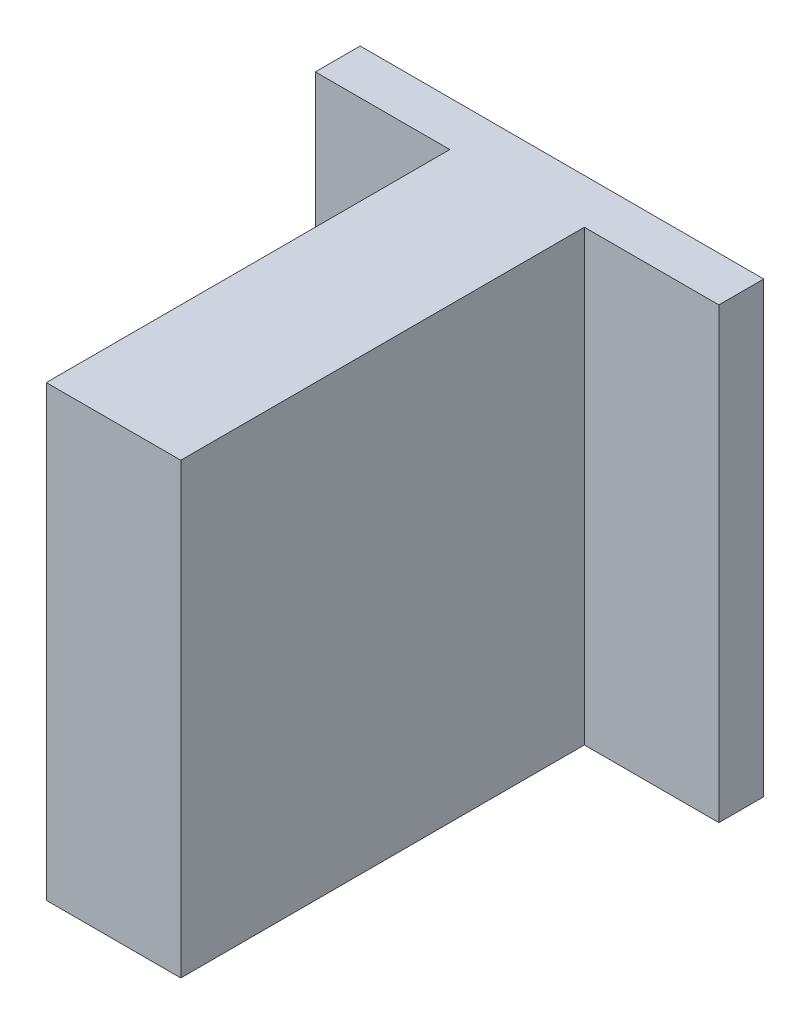
ISO-10303-21;
HEADER;
FILE_DESCRIPTION(('STEP AP214'),'2;1');
FILE_NAME('part.step','',(''),(''),'','','');
FILE_SCHEMA(('AUTOMOTIVE_DESIGN { 1 0 10303 214 1 1 1 1 }'));
ENDSEC;
DATA;
#1=APPLICATION_CONTEXT('core data for automotive mechanical design processes');
#2=APPLICATION_PROTOCOL_DEFINITION('international standard','automotive_design',2000,#1);
#3=PRODUCT_CONTEXT('',#1,'mechanical');
#4=PRODUCT('Part','Part','',(#3));
#5=PRODUCT_RELATED_PRODUCT_CATEGORY('part','',(#4));
#6=PRODUCT_DEFINITION_FORMATION('','',#4);
#7=PRODUCT_DEFINITION_CONTEXT('part definition',#1,'design');
#8=PRODUCT_DEFINITION('design','',#6,#7);
#9=PRODUCT_DEFINITION_SHAPE('','',#8);
#10=(LENGTH_UNIT() NAMED_UNIT(*) SI_UNIT(.MILLI.,.METRE.));
#11=(NAMED_UNIT(*) PLANE_ANGLE_UNIT() SI_UNIT($,.RADIAN.));
#12=(NAMED_UNIT(*) SI_UNIT($,.STERADIAN.) SOLID_ANGLE_UNIT());
#13=UNCERTAINTY_MEASURE_WITH_UNIT(LENGTH_MEASURE(1.E-05),#10,'distance_accuracy_value','');
#14=(GEOMETRIC_REPRESENTATION_CONTEXT(3) GLOBAL_UNCERTAINTY_ASSIGNED_CONTEXT((#13)) GLOBAL_UNIT_ASSIGNED_CONTEXT((#10,
#11,#12)) REPRESENTATION_CONTEXT('',''));
#15=CARTESIAN_POINT('',(0.,0.,0.));
#16=DIRECTION('',(0.,0.,1.));
#17=DIRECTION('',(1.,0.,0.));
#18=AXIS2_PLACEMENT_3D('',#15,#16,#17);
#19=CARTESIAN_POINT('',(0.,0.,0.));
#20=DIRECTION('',(1.,0.,0.));
#21=DIRECTION('',(0.,0.,-1.));
#22=AXIS2_PLACEMENT_3D('',#19,#20,#21);
#23=PLANE('',#22);
#24=DIRECTION('',(0.,1.,0.));
#25=VECTOR('',#24,1.);
#26=CARTESIAN_POINT('',(0.,25.4,2.54));
#27=LINE('',#26,#25);
#28=CARTESIAN_POINT('',(0.,0.,2.54));
#29=VERTEX_POINT('',#28);
#30=CARTESIAN_POINT('',(0.,25.4,2.54));
#31=VERTEX_POINT('',#30);
#32=EDGE_CURVE('E63',#29,#31,#27,.T.);
#33=ORIENTED_EDGE('',*,*,#32,.F.);
#34=DIRECTION('',(0.,0.,-1.));
#35=VECTOR('',#34,1.);
#36=CARTESIAN_POINT('',(0.,0.,0.));
#37=LINE('',#36,#35);
#38=CARTESIAN_POINT('',(0.,0.,25.4));
#39=VERTEX_POINT('',#38);
#40=EDGE_CURVE('E171',#39,#29,#37,.T.);
#41=ORIENTED_EDGE('',*,*,#40,.F.);
#42=DIRECTION('',(0.,-1.,0.));
#43=VECTOR('',#42,1.);
#44=CARTESIAN_POINT('',(0.,0.,25.4));
#45=LINE('',#44,#43);
#46=CARTESIAN_POINT('',(0.,25.4,25.4));
#47=VERTEX_POINT('',#46);
#48=EDGE_CURVE('E168',#47,#39,#45,.T.);
#49=ORIENTED_EDGE('',*,*,#48,.F.);
#50=DIRECTION('',(0.,0.,1.));
#51=VECTOR('',#50,1.);
#52=CARTESIAN_POINT('',(0.,25.4,0.));
#53=LINE('',#52,#51);
#54=EDGE_CURVE('E165',#31,#47,#53,.T.);
#55=ORIENTED_EDGE('',*,*,#54,.F.);
#56=EDGE_LOOP('',(#33,#41,#49,#55));
#57=FACE_BOUND('',#56,.T.);
#58=ADVANCED_FACE('F39',(#57),#23,.F.);
#59=CARTESIAN_POINT('',(3.81,0.,0.));
#60=DIRECTION('',(0.,0.,1.));
#61=DIRECTION('',(1.,0.,0.));
#62=AXIS2_PLACEMENT_3D('',#59,#60,#61);
#63=PLANE('',#62);
#64=DIRECTION('',(-1.,0.,0.));
#65=VECTOR('',#64,1.);
#66=CARTESIAN_POINT('',(3.81,0.,0.));
#67=LINE('',#66,#65);
#68=CARTESIAN_POINT('',(15.24,0.,0.));
#69=VERTEX_POINT('',#68);
#70=CARTESIAN_POINT('',(-7.62,0.,0.));
#71=VERTEX_POINT('',#70);
#72=EDGE_CURVE('E174',#69,#71,#67,.T.);
#73=ORIENTED_EDGE('',*,*,#72,.T.);
#74=DIRECTION('',(0.,-1.,0.));
#75=VECTOR('',#74,1.);
#76=CARTESIAN_POINT('',(-7.62,25.4,0.));
#77=LINE('',#76,#75);
#78=CARTESIAN_POINT('',(-7.62,25.4,0.));
#79=VERTEX_POINT('',#78);
#80=EDGE_CURVE('E141',#79,#71,#77,.T.);
#81=ORIENTED_EDGE('',*,*,#80,.F.);
#82=DIRECTION('',(-1.,0.,0.));
#83=VECTOR('',#82,1.);
#84=CARTESIAN_POINT('',(3.81,25.4,0.));
#85=LINE('',#84,#83);
#86=CARTESIAN_POINT('',(15.24,25.4,0.));
#87=VERTEX_POINT('',#86);
#88=EDGE_CURVE('E11',#87,#79,#85,.T.);
#89=ORIENTED_EDGE('',*,*,#88,.F.);
#90=DIRECTION('',(0.,-1.,0.));
#91=VECTOR('',#90,1.);
#92=CARTESIAN_POINT('',(15.24,25.4,0.));
#93=LINE('',#92,#91);
#94=EDGE_CURVE('E113',#87,#69,#93,.T.);
#95=ORIENTED_EDGE('',*,*,#94,.T.);
#96=EDGE_LOOP('',(#73,#81,#89,#95));
#97=FACE_BOUND('',#96,.T.);
#98=ADVANCED_FACE('F41',(#97),#63,.F.);
#99=CARTESIAN_POINT('',(3.81,25.4,0.));
#100=DIRECTION('',(0.,-1.,0.));
#101=DIRECTION('',(0.,0.,-1.));
#102=AXIS2_PLACEMENT_3D('',#99,#100,#101);
#103=PLANE('',#102);
#104=ORIENTED_EDGE('',*,*,#88,.T.);
#105=DIRECTION('',(0.,0.,-1.));
#106=VECTOR('',#105,1.);
#107=CARTESIAN_POINT('',(-7.62,25.4,2.54));
#108=LINE('',#107,#106);
#109=CARTESIAN_POINT('',(-7.62,25.4,2.54));
#110=VERTEX_POINT('',#109);
#111=EDGE_CURVE('E161',#110,#79,#108,.T.);
#112=ORIENTED_EDGE('',*,*,#111,.F.);
#113=DIRECTION('',(-1.,0.,0.));
#114=VECTOR('',#113,1.);
#115=CARTESIAN_POINT('',(0.,25.4,2.54));
#116=LINE('',#115,#114);
#117=EDGE_CURVE('E144',#31,#110,#116,.T.);
#118=ORIENTED_EDGE('',*,*,#117,.F.);
#119=ORIENTED_EDGE('',*,*,#54,.T.);
#120=DIRECTION('',(-1.,0.,0.));
#121=VECTOR('',#120,1.);
#122=CARTESIAN_POINT('',(3.81,25.4,25.4));
#123=LINE('',#122,#121);
#124=CARTESIAN_POINT('',(7.62,25.4,25.4));
#125=VERTEX_POINT('',#124);
#126=EDGE_CURVE('E48',#125,#47,#123,.T.);
#127=ORIENTED_EDGE('',*,*,#126,.F.);
#128=DIRECTION('',(0.,0.,1.));
#129=VECTOR('',#128,1.);
#130=CARTESIAN_POINT('',(7.62,25.4,0.));
#131=LINE('',#130,#129);
#132=CARTESIAN_POINT('',(7.62,25.4,2.54));
#133=VERTEX_POINT('',#132);
#134=EDGE_CURVE('E133',#133,#125,#131,.T.);
#135=ORIENTED_EDGE('',*,*,#134,.F.);
#136=DIRECTION('',(1.,0.,0.));
#137=VECTOR('',#136,1.);
#138=CARTESIAN_POINT('',(7.62,25.4,2.54));
#139=LINE('',#138,#137);
#140=CARTESIAN_POINT('',(15.24,25.4,2.54));
#141=VERTEX_POINT('',#140);
#142=EDGE_CURVE('E55',#133,#141,#139,.T.);
#143=ORIENTED_EDGE('',*,*,#142,.T.);
#144=DIRECTION('',(0.,0.,-1.));
#145=VECTOR('',#144,1.);
#146=CARTESIAN_POINT('',(15.24,25.4,2.54));
#147=LINE('',#146,#145);
#148=EDGE_CURVE('E135',#141,#87,#147,.T.);
#149=ORIENTED_EDGE('',*,*,#148,.T.);
#150=EDGE_LOOP('',(#104,#112,#118,#119,#127,#135,#143,#149));
#151=FACE_BOUND('',#150,.T.);
#152=ADVANCED_FACE('F209',(#151),#103,.F.);
#153=CARTESIAN_POINT('',(3.81,0.,25.4));
#154=DIRECTION('',(0.,0.,-1.));
#155=DIRECTION('',(-1.,0.,0.));
#156=AXIS2_PLACEMENT_3D('',#153,#154,#155);
#157=PLANE('',#156);
#158=ORIENTED_EDGE('',*,*,#48,.T.);
#159=DIRECTION('',(-1.,0.,0.));
#160=VECTOR('',#159,1.);
#161=CARTESIAN_POINT('',(3.81,0.,25.4));
#162=LINE('',#161,#160);
#163=CARTESIAN_POINT('',(7.62,0.,25.4));
#164=VERTEX_POINT('',#163);
#165=EDGE_CURVE('E177',#164,#39,#162,.T.);
#166=ORIENTED_EDGE('',*,*,#165,.F.);
#167=DIRECTION('',(0.,-1.,0.));
#168=VECTOR('',#167,1.);
#169=CARTESIAN_POINT('',(7.62,0.,25.4));
#170=LINE('',#169,#168);
#171=EDGE_CURVE('E128',#125,#164,#170,.T.);
#172=ORIENTED_EDGE('',*,*,#171,.F.);
#173=ORIENTED_EDGE('',*,*,#126,.T.);
#174=EDGE_LOOP('',(#158,#166,#172,#173));
#175=FACE_BOUND('',#174,.T.);
#176=ADVANCED_FACE('F184',(#175),#157,.F.);
#177=CARTESIAN_POINT('',(3.81,0.,0.));
#178=DIRECTION('',(0.,1.,0.));
#179=DIRECTION('',(0.,0.,1.));
#180=AXIS2_PLACEMENT_3D('',#177,#178,#179);
#181=PLANE('',#180);
#182=ORIENTED_EDGE('',*,*,#40,.T.);
#183=DIRECTION('',(1.,0.,0.));
#184=VECTOR('',#183,1.);
#185=CARTESIAN_POINT('',(0.,0.,2.54));
#186=LINE('',#185,#184);
#187=CARTESIAN_POINT('',(-7.62,0.,2.54));
#188=VERTEX_POINT('',#187);
#189=EDGE_CURVE('E150',#188,#29,#186,.T.);
#190=ORIENTED_EDGE('',*,*,#189,.F.);
#191=DIRECTION('',(0.,0.,-1.));
#192=VECTOR('',#191,1.);
#193=CARTESIAN_POINT('',(-7.62,0.,2.54));
#194=LINE('',#193,#192);
#195=EDGE_CURVE('E154',#188,#71,#194,.T.);
#196=ORIENTED_EDGE('',*,*,#195,.T.);
#197=ORIENTED_EDGE('',*,*,#72,.F.);
#198=DIRECTION('',(0.,0.,-1.));
#199=VECTOR('',#198,1.);
#200=CARTESIAN_POINT('',(15.24,0.,2.54));
#201=LINE('',#200,#199);
#202=CARTESIAN_POINT('',(15.24,0.,2.54));
#203=VERTEX_POINT('',#202);
#204=EDGE_CURVE('E122',#203,#69,#201,.T.);
#205=ORIENTED_EDGE('',*,*,#204,.F.);
#206=DIRECTION('',(-1.,0.,0.));
#207=VECTOR('',#206,1.);
#208=CARTESIAN_POINT('',(7.62,0.,2.54));
#209=LINE('',#208,#207);
#210=CARTESIAN_POINT('',(7.62,0.,2.54));
#211=VERTEX_POINT('',#210);
#212=EDGE_CURVE('E107',#203,#211,#209,.T.);
#213=ORIENTED_EDGE('',*,*,#212,.T.);
#214=DIRECTION('',(0.,0.,-1.));
#215=VECTOR('',#214,1.);
#216=CARTESIAN_POINT('',(7.62,0.,0.));
#217=LINE('',#216,#215);
#218=EDGE_CURVE('E119',#164,#211,#217,.T.);
#219=ORIENTED_EDGE('',*,*,#218,.F.);
#220=ORIENTED_EDGE('',*,*,#165,.T.);
#221=EDGE_LOOP('',(#182,#190,#196,#197,#205,#213,#219,#220));
#222=FACE_BOUND('',#221,.T.);
#223=ADVANCED_FACE('F117',(#222),#181,.F.);
#224=CARTESIAN_POINT('',(-7.62,25.4,2.54));
#225=DIRECTION('',(1.,0.,0.));
#226=DIRECTION('',(0.,1.,0.));
#227=AXIS2_PLACEMENT_3D('',#224,#225,#226);
#228=PLANE('',#227);
#229=ORIENTED_EDGE('',*,*,#80,.T.);
#230=ORIENTED_EDGE('',*,*,#195,.F.);
#231=DIRECTION('',(0.,-1.,0.));
#232=VECTOR('',#231,1.);
#233=CARTESIAN_POINT('',(-7.62,25.4,2.54));
#234=LINE('',#233,#232);
#235=EDGE_CURVE('E147',#110,#188,#234,.T.);
#236=ORIENTED_EDGE('',*,*,#235,.F.);
#237=ORIENTED_EDGE('',*,*,#111,.T.);
#238=EDGE_LOOP('',(#229,#230,#236,#237));
#239=FACE_BOUND('',#238,.T.);
#240=ADVANCED_FACE('F194',(#239),#228,.F.);
#241=CARTESIAN_POINT('',(0.,0.,2.54));
#242=DIRECTION('',(0.,0.,-1.));
#243=DIRECTION('',(-1.,0.,0.));
#244=AXIS2_PLACEMENT_3D('',#241,#242,#243);
#245=PLANE('',#244);
#246=ORIENTED_EDGE('',*,*,#32,.T.);
#247=ORIENTED_EDGE('',*,*,#117,.T.);
#248=ORIENTED_EDGE('',*,*,#235,.T.);
#249=ORIENTED_EDGE('',*,*,#189,.T.);
#250=EDGE_LOOP('',(#246,#247,#248,#249));
#251=FACE_BOUND('',#250,.T.);
#252=ADVANCED_FACE('F189',(#251),#245,.F.);
#253=CARTESIAN_POINT('',(7.62,0.,0.));
#254=DIRECTION('',(-1.,0.,0.));
#255=DIRECTION('',(0.,0.,-1.));
#256=AXIS2_PLACEMENT_3D('',#253,#254,#255);
#257=PLANE('',#256);
#258=ORIENTED_EDGE('',*,*,#218,.T.);
#259=DIRECTION('',(0.,1.,0.));
#260=VECTOR('',#259,1.);
#261=CARTESIAN_POINT('',(7.62,25.4,2.54));
#262=LINE('',#261,#260);
#263=EDGE_CURVE('E104',#211,#133,#262,.T.);
#264=ORIENTED_EDGE('',*,*,#263,.T.);
#265=ORIENTED_EDGE('',*,*,#134,.T.);
#266=ORIENTED_EDGE('',*,*,#171,.T.);
#267=EDGE_LOOP('',(#258,#264,#265,#266));
#268=FACE_BOUND('',#267,.T.);
#269=ADVANCED_FACE('F126',(#268),#257,.F.);
#270=CARTESIAN_POINT('',(15.24,25.4,2.54));
#271=DIRECTION('',(1.,0.,0.));
#272=DIRECTION('',(0.,1.,0.));
#273=AXIS2_PLACEMENT_3D('',#270,#271,#272);
#274=PLANE('',#273);
#275=ORIENTED_EDGE('',*,*,#94,.F.);
#276=ORIENTED_EDGE('',*,*,#148,.F.);
#277=DIRECTION('',(0.,-1.,0.));
#278=VECTOR('',#277,1.);
#279=CARTESIAN_POINT('',(15.24,25.4,2.54));
#280=LINE('',#279,#278);
#281=EDGE_CURVE('E124',#141,#203,#280,.T.);
#282=ORIENTED_EDGE('',*,*,#281,.T.);
#283=ORIENTED_EDGE('',*,*,#204,.T.);
#284=EDGE_LOOP('',(#275,#276,#282,#283));
#285=FACE_BOUND('',#284,.T.);
#286=ADVANCED_FACE('F200',(#285),#274,.T.);
#287=CARTESIAN_POINT('',(7.62,0.,2.54));
#288=DIRECTION('',(0.,0.,-1.));
#289=DIRECTION('',(1.,0.,0.));
#290=AXIS2_PLACEMENT_3D('',#287,#288,#289);
#291=PLANE('',#290);
#292=ORIENTED_EDGE('',*,*,#263,.F.);
#293=ORIENTED_EDGE('',*,*,#212,.F.);
#294=ORIENTED_EDGE('',*,*,#281,.F.);
#295=ORIENTED_EDGE('',*,*,#142,.F.);
#296=EDGE_LOOP('',(#292,#293,#294,#295));
#297=FACE_BOUND('',#296,.T.);
#298=ADVANCED_FACE('F106',(#297),#291,.F.);
#299=CLOSED_SHELL('',(#58,#98,#152,#176,#223,#240,#252,#269,#286,#298));
#300=MANIFOLD_SOLID_BREP('B2',#299);
#301=ADVANCED_BREP_SHAPE_REPRESENTATION('',(#18,#300),#14);
#302=SHAPE_DEFINITION_REPRESENTATION(#9,#301);
ENDSEC;
END-ISO-10303-21;
